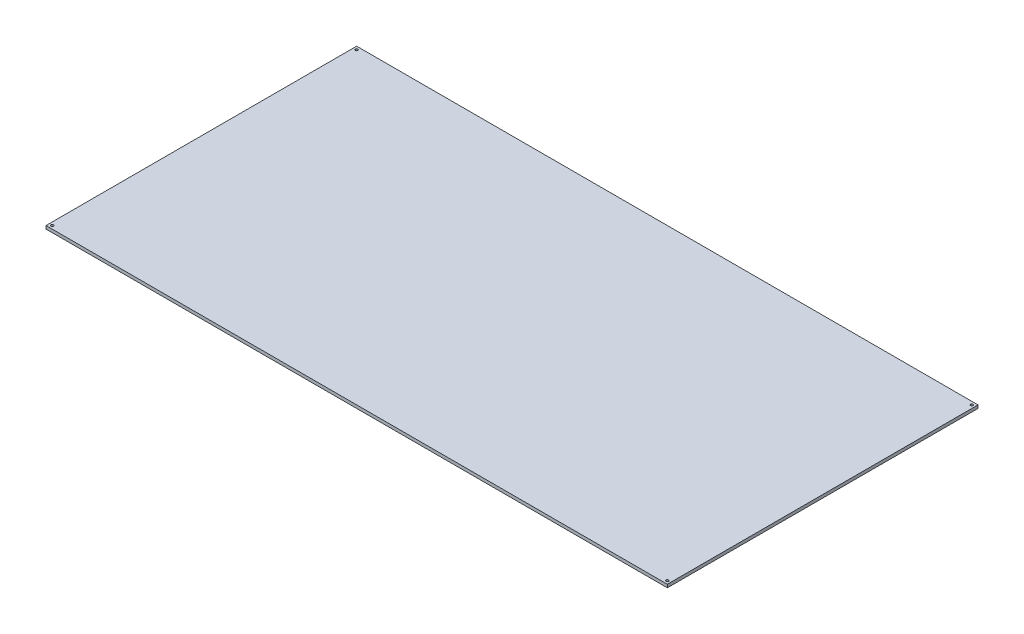
ISO-10303-21;
HEADER;
FILE_DESCRIPTION(('STEP AP214'),'2;1');
FILE_NAME('part.step','',(''),(''),'','','');
FILE_SCHEMA(('AUTOMOTIVE_DESIGN { 1 0 10303 214 1 1 1 1 }'));
ENDSEC;
DATA;
#1=APPLICATION_CONTEXT('core data for automotive mechanical design processes');
#2=APPLICATION_PROTOCOL_DEFINITION('international standard','automotive_design',2000,#1);
#3=PRODUCT_CONTEXT('',#1,'mechanical');
#4=PRODUCT('Part','Part','',(#3));
#5=PRODUCT_RELATED_PRODUCT_CATEGORY('part','',(#4));
#6=PRODUCT_DEFINITION_FORMATION('','',#4);
#7=PRODUCT_DEFINITION_CONTEXT('part definition',#1,'design');
#8=PRODUCT_DEFINITION('design','',#6,#7);
#9=PRODUCT_DEFINITION_SHAPE('','',#8);
#10=(LENGTH_UNIT() NAMED_UNIT(*) SI_UNIT(.MILLI.,.METRE.));
#11=(NAMED_UNIT(*) PLANE_ANGLE_UNIT() SI_UNIT($,.RADIAN.));
#12=(NAMED_UNIT(*) SI_UNIT($,.STERADIAN.) SOLID_ANGLE_UNIT());
#13=UNCERTAINTY_MEASURE_WITH_UNIT(LENGTH_MEASURE(1.E-05),#10,'distance_accuracy_value','');
#14=(GEOMETRIC_REPRESENTATION_CONTEXT(3) GLOBAL_UNCERTAINTY_ASSIGNED_CONTEXT((#13)) GLOBAL_UNIT_ASSIGNED_CONTEXT((#10,
#11,#12)) REPRESENTATION_CONTEXT('',''));
#15=CARTESIAN_POINT('',(0.,0.,0.));
#16=DIRECTION('',(0.,0.,1.));
#17=DIRECTION('',(1.,0.,0.));
#18=AXIS2_PLACEMENT_3D('',#15,#16,#17);
#19=CARTESIAN_POINT('',(-971.705582826615,10.,-454.797229754228));
#20=DIRECTION('',(1.,0.,0.));
#21=DIRECTION('',(0.,0.,-1.));
#22=AXIS2_PLACEMENT_3D('',#19,#20,#21);
#23=PLANE('',#22);
#24=DIRECTION('',(0.,0.,1.));
#25=VECTOR('',#24,1.);
#26=CARTESIAN_POINT('',(-971.705582826615,0.,-454.797229754228));
#27=LINE('',#26,#25);
#28=CARTESIAN_POINT('',(-971.705582826615,0.,-454.797229754228));
#29=VERTEX_POINT('',#28);
#30=CARTESIAN_POINT('',(-971.705582826615,0.,545.202770245772));
#31=VERTEX_POINT('',#30);
#32=EDGE_CURVE('E101',#29,#31,#27,.T.);
#33=ORIENTED_EDGE('',*,*,#32,.T.);
#34=DIRECTION('',(0.,-1.,0.));
#35=VECTOR('',#34,1.);
#36=CARTESIAN_POINT('',(-971.705582826615,10.,545.202770245772));
#37=LINE('',#36,#35);
#38=CARTESIAN_POINT('',(-971.705582826615,10.,545.202770245772));
#39=VERTEX_POINT('',#38);
#40=EDGE_CURVE('E11',#39,#31,#37,.T.);
#41=ORIENTED_EDGE('',*,*,#40,.F.);
#42=DIRECTION('',(0.,0.,1.));
#43=VECTOR('',#42,1.);
#44=CARTESIAN_POINT('',(-971.705582826615,10.,-454.797229754228));
#45=LINE('',#44,#43);
#46=CARTESIAN_POINT('',(-971.705582826615,10.,-454.797229754228));
#47=VERTEX_POINT('',#46);
#48=EDGE_CURVE('E89',#47,#39,#45,.T.);
#49=ORIENTED_EDGE('',*,*,#48,.F.);
#50=DIRECTION('',(0.,-1.,0.));
#51=VECTOR('',#50,1.);
#52=CARTESIAN_POINT('',(-971.705582826615,10.,-454.797229754228));
#53=LINE('',#52,#51);
#54=EDGE_CURVE('E97',#47,#29,#53,.T.);
#55=ORIENTED_EDGE('',*,*,#54,.T.);
#56=EDGE_LOOP('',(#33,#41,#49,#55));
#57=FACE_BOUND('',#56,.T.);
#58=ADVANCED_FACE('F38',(#57),#23,.F.);
#59=CARTESIAN_POINT('',(-971.705582826615,10.,545.202770245772));
#60=DIRECTION('',(0.,0.,-1.));
#61=DIRECTION('',(-1.,0.,0.));
#62=AXIS2_PLACEMENT_3D('',#59,#60,#61);
#63=PLANE('',#62);
#64=DIRECTION('',(1.,0.,0.));
#65=VECTOR('',#64,1.);
#66=CARTESIAN_POINT('',(-971.705582826615,0.,545.202770245772));
#67=LINE('',#66,#65);
#68=CARTESIAN_POINT('',(1028.29441717338,0.,545.202770245772));
#69=VERTEX_POINT('',#68);
#70=EDGE_CURVE('E93',#31,#69,#67,.T.);
#71=ORIENTED_EDGE('',*,*,#70,.T.);
#72=DIRECTION('',(0.,-1.,0.));
#73=VECTOR('',#72,1.);
#74=CARTESIAN_POINT('',(1028.29441717338,10.,545.202770245772));
#75=LINE('',#74,#73);
#76=CARTESIAN_POINT('',(1028.29441717338,10.,545.202770245772));
#77=VERTEX_POINT('',#76);
#78=EDGE_CURVE('E46',#77,#69,#75,.T.);
#79=ORIENTED_EDGE('',*,*,#78,.F.);
#80=DIRECTION('',(1.,0.,0.));
#81=VECTOR('',#80,1.);
#82=CARTESIAN_POINT('',(-971.705582826615,10.,545.202770245772));
#83=LINE('',#82,#81);
#84=EDGE_CURVE('E84',#39,#77,#83,.T.);
#85=ORIENTED_EDGE('',*,*,#84,.F.);
#86=ORIENTED_EDGE('',*,*,#40,.T.);
#87=EDGE_LOOP('',(#71,#79,#85,#86));
#88=FACE_BOUND('',#87,.T.);
#89=ADVANCED_FACE('F92',(#88),#63,.F.);
#90=CARTESIAN_POINT('',(1028.29441717339,10.,-454.797229754228));
#91=DIRECTION('',(-1.,0.,0.));
#92=DIRECTION('',(0.,0.,1.));
#93=AXIS2_PLACEMENT_3D('',#90,#91,#92);
#94=PLANE('',#93);
#95=DIRECTION('',(0.,0.,-1.));
#96=VECTOR('',#95,1.);
#97=CARTESIAN_POINT('',(1028.29441717339,0.,-454.797229754228));
#98=LINE('',#97,#96);
#99=CARTESIAN_POINT('',(1028.29441717339,0.,-454.797229754228));
#100=VERTEX_POINT('',#99);
#101=EDGE_CURVE('E71',#69,#100,#98,.T.);
#102=ORIENTED_EDGE('',*,*,#101,.T.);
#103=DIRECTION('',(0.,-1.,0.));
#104=VECTOR('',#103,1.);
#105=CARTESIAN_POINT('',(1028.29441717339,10.,-454.797229754228));
#106=LINE('',#105,#104);
#107=CARTESIAN_POINT('',(1028.29441717339,10.,-454.797229754228));
#108=VERTEX_POINT('',#107);
#109=EDGE_CURVE('E94',#108,#100,#106,.T.);
#110=ORIENTED_EDGE('',*,*,#109,.F.);
#111=DIRECTION('',(0.,0.,-1.));
#112=VECTOR('',#111,1.);
#113=CARTESIAN_POINT('',(1028.29441717339,10.,-454.797229754228));
#114=LINE('',#113,#112);
#115=EDGE_CURVE('E87',#77,#108,#114,.T.);
#116=ORIENTED_EDGE('',*,*,#115,.F.);
#117=ORIENTED_EDGE('',*,*,#78,.T.);
#118=EDGE_LOOP('',(#102,#110,#116,#117));
#119=FACE_BOUND('',#118,.T.);
#120=ADVANCED_FACE('F95',(#119),#94,.F.);
#121=CARTESIAN_POINT('',(-971.705582826615,10.,-454.797229754228));
#122=DIRECTION('',(0.,0.,1.));
#123=DIRECTION('',(1.,0.,0.));
#124=AXIS2_PLACEMENT_3D('',#121,#122,#123);
#125=PLANE('',#124);
#126=DIRECTION('',(-1.,0.,0.));
#127=VECTOR('',#126,1.);
#128=CARTESIAN_POINT('',(-971.705582826615,0.,-454.797229754228));
#129=LINE('',#128,#127);
#130=EDGE_CURVE('E77',#100,#29,#129,.T.);
#131=ORIENTED_EDGE('',*,*,#130,.T.);
#132=ORIENTED_EDGE('',*,*,#54,.F.);
#133=DIRECTION('',(-1.,0.,0.));
#134=VECTOR('',#133,1.);
#135=CARTESIAN_POINT('',(-971.705582826615,10.,-454.797229754228));
#136=LINE('',#135,#134);
#137=EDGE_CURVE('E54',#108,#47,#136,.T.);
#138=ORIENTED_EDGE('',*,*,#137,.F.);
#139=ORIENTED_EDGE('',*,*,#109,.T.);
#140=EDGE_LOOP('',(#131,#132,#138,#139));
#141=FACE_BOUND('',#140,.T.);
#142=ADVANCED_FACE('F109',(#141),#125,.F.);
#143=CARTESIAN_POINT('',(0.,10.,0.));
#144=DIRECTION('',(0.,1.,0.));
#145=DIRECTION('',(0.,0.,1.));
#146=AXIS2_PLACEMENT_3D('',#143,#144,#145);
#147=PLANE('',#146);
#148=CARTESIAN_POINT('',(-961.705582826605,10.,535.202770245772));
#149=DIRECTION('',(0.,1.,0.));
#150=DIRECTION('',(0.,0.,1.));
#151=AXIS2_PLACEMENT_3D('',#148,#149,#150);
#152=CIRCLE('',#151,3.99999999999999);
#153=CARTESIAN_POINT('',(-961.705582826605,10.,539.202770245772));
#154=VERTEX_POINT('',#153);
#155=EDGE_CURVE('E121',#154,#154,#152,.T.);
#156=ORIENTED_EDGE('',*,*,#155,.F.);
#157=EDGE_LOOP('',(#156));
#158=FACE_BOUND('',#157,.T.);
#159=CARTESIAN_POINT('',(1018.2944171734,10.,535.202770245772));
#160=DIRECTION('',(0.,1.,0.));
#161=DIRECTION('',(0.,0.,1.));
#162=AXIS2_PLACEMENT_3D('',#159,#160,#161);
#163=CIRCLE('',#162,4.00000000000021);
#164=CARTESIAN_POINT('',(1018.2944171734,10.,539.202770245772));
#165=VERTEX_POINT('',#164);
#166=EDGE_CURVE('E127',#165,#165,#163,.T.);
#167=ORIENTED_EDGE('',*,*,#166,.F.);
#168=EDGE_LOOP('',(#167));
#169=FACE_BOUND('',#168,.T.);
#170=CARTESIAN_POINT('',(1018.29441717338,10.,-444.797229754228));
#171=DIRECTION('',(0.,1.,0.));
#172=DIRECTION('',(0.,0.,1.));
#173=AXIS2_PLACEMENT_3D('',#170,#171,#172);
#174=CIRCLE('',#173,4.00000000000021);
#175=CARTESIAN_POINT('',(1018.29441717338,10.,-440.797229754228));
#176=VERTEX_POINT('',#175);
#177=EDGE_CURVE('E133',#176,#176,#174,.T.);
#178=ORIENTED_EDGE('',*,*,#177,.F.);
#179=EDGE_LOOP('',(#178));
#180=FACE_BOUND('',#179,.T.);
#181=CARTESIAN_POINT('',(-961.705582826615,10.,-444.797229754228));
#182=DIRECTION('',(0.,1.,0.));
#183=DIRECTION('',(0.,0.,1.));
#184=AXIS2_PLACEMENT_3D('',#181,#182,#183);
#185=CIRCLE('',#184,3.99999999999999);
#186=CARTESIAN_POINT('',(-961.705582826615,10.,-440.797229754228));
#187=VERTEX_POINT('',#186);
#188=EDGE_CURVE('E115',#187,#187,#185,.T.);
#189=ORIENTED_EDGE('',*,*,#188,.F.);
#190=EDGE_LOOP('',(#189));
#191=FACE_BOUND('',#190,.T.);
#192=ORIENTED_EDGE('',*,*,#48,.T.);
#193=ORIENTED_EDGE('',*,*,#84,.T.);
#194=ORIENTED_EDGE('',*,*,#115,.T.);
#195=ORIENTED_EDGE('',*,*,#137,.T.);
#196=EDGE_LOOP('',(#192,#193,#194,#195));
#197=FACE_BOUND('',#196,.T.);
#198=ADVANCED_FACE('F85',(#158,#169,#180,#191,#197),#147,.T.);
#199=CARTESIAN_POINT('',(0.,0.,0.));
#200=DIRECTION('',(0.,1.,0.));
#201=DIRECTION('',(0.,0.,1.));
#202=AXIS2_PLACEMENT_3D('',#199,#200,#201);
#203=PLANE('',#202);
#204=CARTESIAN_POINT('',(-961.705582826605,0.,535.202770245772));
#205=DIRECTION('',(0.,1.,0.));
#206=DIRECTION('',(0.,0.,1.));
#207=AXIS2_PLACEMENT_3D('',#204,#205,#206);
#208=CIRCLE('',#207,3.99999999999999);
#209=CARTESIAN_POINT('',(-961.705582826605,0.,539.202770245772));
#210=VERTEX_POINT('',#209);
#211=EDGE_CURVE('E124',#210,#210,#208,.T.);
#212=ORIENTED_EDGE('',*,*,#211,.T.);
#213=EDGE_LOOP('',(#212));
#214=FACE_BOUND('',#213,.T.);
#215=CARTESIAN_POINT('',(1018.2944171734,0.,535.202770245772));
#216=DIRECTION('',(0.,1.,0.));
#217=DIRECTION('',(0.,0.,1.));
#218=AXIS2_PLACEMENT_3D('',#215,#216,#217);
#219=CIRCLE('',#218,4.00000000000021);
#220=CARTESIAN_POINT('',(1018.2944171734,0.,539.202770245772));
#221=VERTEX_POINT('',#220);
#222=EDGE_CURVE('E130',#221,#221,#219,.T.);
#223=ORIENTED_EDGE('',*,*,#222,.T.);
#224=EDGE_LOOP('',(#223));
#225=FACE_BOUND('',#224,.T.);
#226=CARTESIAN_POINT('',(1018.29441717338,0.,-444.797229754228));
#227=DIRECTION('',(0.,1.,0.));
#228=DIRECTION('',(0.,0.,1.));
#229=AXIS2_PLACEMENT_3D('',#226,#227,#228);
#230=CIRCLE('',#229,4.00000000000021);
#231=CARTESIAN_POINT('',(1018.29441717338,0.,-440.797229754228));
#232=VERTEX_POINT('',#231);
#233=EDGE_CURVE('E118',#232,#232,#230,.T.);
#234=ORIENTED_EDGE('',*,*,#233,.T.);
#235=EDGE_LOOP('',(#234));
#236=FACE_BOUND('',#235,.T.);
#237=CARTESIAN_POINT('',(-961.705582826615,0.,-444.797229754228));
#238=DIRECTION('',(0.,1.,0.));
#239=DIRECTION('',(0.,0.,1.));
#240=AXIS2_PLACEMENT_3D('',#237,#238,#239);
#241=CIRCLE('',#240,3.99999999999999);
#242=CARTESIAN_POINT('',(-961.705582826615,0.,-440.797229754228));
#243=VERTEX_POINT('',#242);
#244=EDGE_CURVE('E104',#243,#243,#241,.T.);
#245=ORIENTED_EDGE('',*,*,#244,.T.);
#246=EDGE_LOOP('',(#245));
#247=FACE_BOUND('',#246,.T.);
#248=ORIENTED_EDGE('',*,*,#32,.F.);
#249=ORIENTED_EDGE('',*,*,#130,.F.);
#250=ORIENTED_EDGE('',*,*,#101,.F.);
#251=ORIENTED_EDGE('',*,*,#70,.F.);
#252=EDGE_LOOP('',(#248,#249,#250,#251));
#253=FACE_BOUND('',#252,.T.);
#254=ADVANCED_FACE('F112',(#214,#225,#236,#247,#253),#203,.F.);
#255=CARTESIAN_POINT('',(-961.705582826615,0.,-444.797229754228));
#256=DIRECTION('',(0.,1.,0.));
#257=DIRECTION('',(0.,0.,1.));
#258=AXIS2_PLACEMENT_3D('',#255,#256,#257);
#259=CYLINDRICAL_SURFACE('',#258,3.99999999999999);
#260=ORIENTED_EDGE('',*,*,#244,.F.);
#261=EDGE_LOOP('',(#260));
#262=FACE_BOUND('',#261,.T.);
#263=ORIENTED_EDGE('',*,*,#188,.T.);
#264=EDGE_LOOP('',(#263));
#265=FACE_BOUND('',#264,.T.);
#266=ADVANCED_FACE('F145',(#262,#265),#259,.F.);
#267=CARTESIAN_POINT('',(1018.29441717338,0.,-444.797229754228));
#268=DIRECTION('',(0.,1.,0.));
#269=DIRECTION('',(0.,0.,1.));
#270=AXIS2_PLACEMENT_3D('',#267,#268,#269);
#271=CYLINDRICAL_SURFACE('',#270,4.00000000000021);
#272=ORIENTED_EDGE('',*,*,#233,.F.);
#273=EDGE_LOOP('',(#272));
#274=FACE_BOUND('',#273,.T.);
#275=ORIENTED_EDGE('',*,*,#177,.T.);
#276=EDGE_LOOP('',(#275));
#277=FACE_BOUND('',#276,.T.);
#278=ADVANCED_FACE('F141',(#274,#277),#271,.F.);
#279=CARTESIAN_POINT('',(1018.2944171734,0.,535.202770245772));
#280=DIRECTION('',(0.,1.,0.));
#281=DIRECTION('',(0.,0.,1.));
#282=AXIS2_PLACEMENT_3D('',#279,#280,#281);
#283=CYLINDRICAL_SURFACE('',#282,4.00000000000021);
#284=ORIENTED_EDGE('',*,*,#222,.F.);
#285=EDGE_LOOP('',(#284));
#286=FACE_BOUND('',#285,.T.);
#287=ORIENTED_EDGE('',*,*,#166,.T.);
#288=EDGE_LOOP('',(#287));
#289=FACE_BOUND('',#288,.T.);
#290=ADVANCED_FACE('F144',(#286,#289),#283,.F.);
#291=CARTESIAN_POINT('',(-961.705582826605,0.,535.202770245772));
#292=DIRECTION('',(0.,1.,0.));
#293=DIRECTION('',(0.,0.,1.));
#294=AXIS2_PLACEMENT_3D('',#291,#292,#293);
#295=CYLINDRICAL_SURFACE('',#294,3.99999999999999);
#296=ORIENTED_EDGE('',*,*,#211,.F.);
#297=EDGE_LOOP('',(#296));
#298=FACE_BOUND('',#297,.T.);
#299=ORIENTED_EDGE('',*,*,#155,.T.);
#300=EDGE_LOOP('',(#299));
#301=FACE_BOUND('',#300,.T.);
#302=ADVANCED_FACE('F206',(#298,#301),#295,.F.);
#303=CLOSED_SHELL('',(#58,#89,#120,#142,#198,#254,#266,#278,#290,#302));
#304=MANIFOLD_SOLID_BREP('B2',#303);
#305=ADVANCED_BREP_SHAPE_REPRESENTATION('',(#18,#304),#14);
#306=SHAPE_DEFINITION_REPRESENTATION(#9,#305);
ENDSEC;
END-ISO-10303-21;
